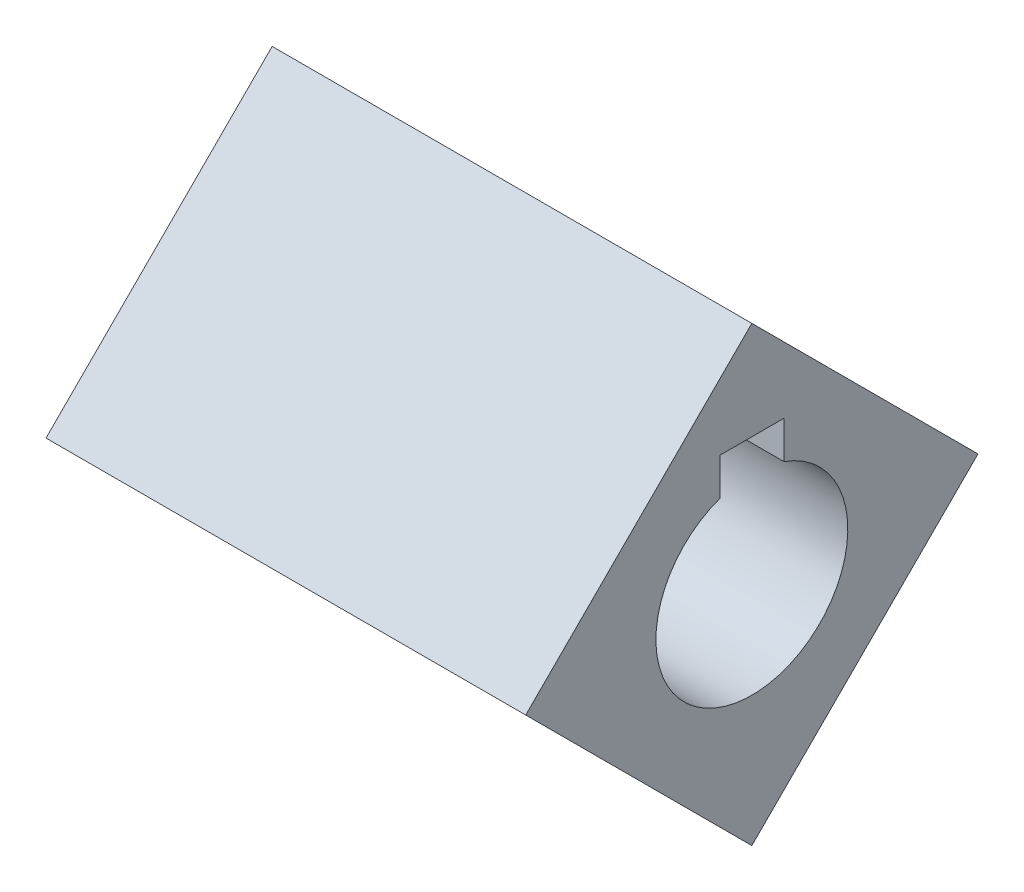
ISO-10303-21;
HEADER;
FILE_DESCRIPTION(('STEP AP214'),'2;1');
FILE_NAME('part.step','',(''),(''),'','','');
FILE_SCHEMA(('AUTOMOTIVE_DESIGN { 1 0 10303 214 1 1 1 1 }'));
ENDSEC;
DATA;
#1=APPLICATION_CONTEXT('core data for automotive mechanical design processes');
#2=APPLICATION_PROTOCOL_DEFINITION('international standard','automotive_design',2000,#1);
#3=PRODUCT_CONTEXT('',#1,'mechanical');
#4=PRODUCT('Part','Part','',(#3));
#5=PRODUCT_RELATED_PRODUCT_CATEGORY('part','',(#4));
#6=PRODUCT_DEFINITION_FORMATION('','',#4);
#7=PRODUCT_DEFINITION_CONTEXT('part definition',#1,'design');
#8=PRODUCT_DEFINITION('design','',#6,#7);
#9=PRODUCT_DEFINITION_SHAPE('','',#8);
#10=(LENGTH_UNIT() NAMED_UNIT(*) SI_UNIT(.MILLI.,.METRE.));
#11=(NAMED_UNIT(*) PLANE_ANGLE_UNIT() SI_UNIT($,.RADIAN.));
#12=(NAMED_UNIT(*) SI_UNIT($,.STERADIAN.) SOLID_ANGLE_UNIT());
#13=UNCERTAINTY_MEASURE_WITH_UNIT(LENGTH_MEASURE(1.E-05),#10,'distance_accuracy_value','');
#14=(GEOMETRIC_REPRESENTATION_CONTEXT(3) GLOBAL_UNCERTAINTY_ASSIGNED_CONTEXT((#13)) GLOBAL_UNIT_ASSIGNED_CONTEXT((#10,
#11,#12)) REPRESENTATION_CONTEXT('',''));
#15=CARTESIAN_POINT('',(0.,0.,0.));
#16=DIRECTION('',(0.,0.,1.));
#17=DIRECTION('',(1.,0.,0.));
#18=AXIS2_PLACEMENT_3D('',#15,#16,#17);
#19=CARTESIAN_POINT('',(0.,0.,0.));
#20=DIRECTION('',(-1.,0.,0.));
#21=DIRECTION('',(0.,0.,1.));
#22=AXIS2_PLACEMENT_3D('',#19,#20,#21);
#23=PLANE('',#22);
#24=DIRECTION('',(0.,1.,0.));
#25=VECTOR('',#24,1.);
#26=CARTESIAN_POINT('',(0.,8.,2.));
#27=LINE('',#26,#25);
#28=CARTESIAN_POINT('',(0.,5.65685424949238,2.));
#29=VERTEX_POINT('',#28);
#30=CARTESIAN_POINT('',(0.,8.,2.));
#31=VERTEX_POINT('',#30);
#32=EDGE_CURVE('E136',#29,#31,#27,.T.);
#33=ORIENTED_EDGE('',*,*,#32,.F.);
#34=CARTESIAN_POINT('',(0.,0.,0.));
#35=DIRECTION('',(-1.,0.,0.));
#36=DIRECTION('',(0.,0.,1.));
#37=AXIS2_PLACEMENT_3D('',#34,#35,#36);
#38=CIRCLE('',#37,6.);
#39=CARTESIAN_POINT('',(0.,5.65685424949238,-2.));
#40=VERTEX_POINT('',#39);
#41=EDGE_CURVE('E151',#40,#29,#38,.T.);
#42=ORIENTED_EDGE('',*,*,#41,.F.);
#43=DIRECTION('',(0.,-1.,0.));
#44=VECTOR('',#43,1.);
#45=CARTESIAN_POINT('',(0.,8.,-2.));
#46=LINE('',#45,#44);
#47=CARTESIAN_POINT('',(0.,8.,-2.));
#48=VERTEX_POINT('',#47);
#49=EDGE_CURVE('E145',#48,#40,#46,.T.);
#50=ORIENTED_EDGE('',*,*,#49,.F.);
#51=DIRECTION('',(0.,0.,-1.));
#52=VECTOR('',#51,1.);
#53=CARTESIAN_POINT('',(0.,8.,-2.));
#54=LINE('',#53,#52);
#55=EDGE_CURVE('E129',#31,#48,#54,.T.);
#56=ORIENTED_EDGE('',*,*,#55,.F.);
#57=EDGE_LOOP('',(#33,#42,#50,#56));
#58=FACE_BOUND('',#57,.T.);
#59=DIRECTION('',(0.,-0.707106781186548,-0.707106781186547));
#60=VECTOR('',#59,1.);
#61=CARTESIAN_POINT('',(0.,0.,14.142135623731));
#62=LINE('',#61,#60);
#63=CARTESIAN_POINT('',(0.,0.,14.1421356237309));
#64=VERTEX_POINT('',#63);
#65=CARTESIAN_POINT('',(0.,-14.142135623731,0.));
#66=VERTEX_POINT('',#65);
#67=EDGE_CURVE('E114',#64,#66,#62,.T.);
#68=ORIENTED_EDGE('',*,*,#67,.F.);
#69=DIRECTION('',(0.,-0.707106781186548,0.707106781186548));
#70=VECTOR('',#69,1.);
#71=CARTESIAN_POINT('',(0.,0.,14.142135623731));
#72=LINE('',#71,#70);
#73=CARTESIAN_POINT('',(0.,14.142135623731,0.));
#74=VERTEX_POINT('',#73);
#75=EDGE_CURVE('E48',#74,#64,#72,.T.);
#76=ORIENTED_EDGE('',*,*,#75,.F.);
#77=DIRECTION('',(0.,0.707106781186548,0.707106781186547));
#78=VECTOR('',#77,1.);
#79=CARTESIAN_POINT('',(0.,14.142135623731,0.));
#80=LINE('',#79,#78);
#81=CARTESIAN_POINT('',(0.,0.,-14.142135623731));
#82=VERTEX_POINT('',#81);
#83=EDGE_CURVE('E102',#82,#74,#80,.T.);
#84=ORIENTED_EDGE('',*,*,#83,.F.);
#85=DIRECTION('',(0.,0.707106781186547,-0.707106781186548));
#86=VECTOR('',#85,1.);
#87=CARTESIAN_POINT('',(0.,-14.142135623731,0.));
#88=LINE('',#87,#86);
#89=EDGE_CURVE('E109',#66,#82,#88,.T.);
#90=ORIENTED_EDGE('',*,*,#89,.F.);
#91=EDGE_LOOP('',(#68,#76,#84,#90));
#92=FACE_BOUND('',#91,.T.);
#93=ADVANCED_FACE('F34',(#58,#92),#23,.T.);
#94=CARTESIAN_POINT('',(30.,17.5,0.));
#95=DIRECTION('',(1.,0.,0.));
#96=DIRECTION('',(0.,0.,-1.));
#97=AXIS2_PLACEMENT_3D('',#94,#95,#96);
#98=PLANE('',#97);
#99=DIRECTION('',(0.,1.,0.));
#100=VECTOR('',#99,1.);
#101=CARTESIAN_POINT('',(30.,8.,2.));
#102=LINE('',#101,#100);
#103=CARTESIAN_POINT('',(30.,5.65685424949238,2.));
#104=VERTEX_POINT('',#103);
#105=CARTESIAN_POINT('',(30.,8.,2.));
#106=VERTEX_POINT('',#105);
#107=EDGE_CURVE('E139',#104,#106,#102,.T.);
#108=ORIENTED_EDGE('',*,*,#107,.T.);
#109=DIRECTION('',(0.,0.,-1.));
#110=VECTOR('',#109,1.);
#111=CARTESIAN_POINT('',(30.,8.,-2.));
#112=LINE('',#111,#110);
#113=CARTESIAN_POINT('',(30.,8.,-2.));
#114=VERTEX_POINT('',#113);
#115=EDGE_CURVE('E132',#106,#114,#112,.T.);
#116=ORIENTED_EDGE('',*,*,#115,.T.);
#117=DIRECTION('',(0.,-1.,0.));
#118=VECTOR('',#117,1.);
#119=CARTESIAN_POINT('',(30.,8.,-2.));
#120=LINE('',#119,#118);
#121=CARTESIAN_POINT('',(30.,5.65685424949238,-2.));
#122=VERTEX_POINT('',#121);
#123=EDGE_CURVE('E135',#114,#122,#120,.T.);
#124=ORIENTED_EDGE('',*,*,#123,.T.);
#125=CARTESIAN_POINT('',(30.,0.,0.));
#126=DIRECTION('',(-1.,0.,0.));
#127=DIRECTION('',(0.,0.,1.));
#128=AXIS2_PLACEMENT_3D('',#125,#126,#127);
#129=CIRCLE('',#128,6.);
#130=EDGE_CURVE('E153',#122,#104,#129,.T.);
#131=ORIENTED_EDGE('',*,*,#130,.T.);
#132=EDGE_LOOP('',(#108,#116,#124,#131));
#133=FACE_BOUND('',#132,.T.);
#134=DIRECTION('',(0.,0.707106781186548,0.707106781186547));
#135=VECTOR('',#134,1.);
#136=CARTESIAN_POINT('',(30.,14.142135623731,0.));
#137=LINE('',#136,#135);
#138=CARTESIAN_POINT('',(30.,0.,-14.142135623731));
#139=VERTEX_POINT('',#138);
#140=CARTESIAN_POINT('',(30.,14.142135623731,0.));
#141=VERTEX_POINT('',#140);
#142=EDGE_CURVE('E104',#139,#141,#137,.T.);
#143=ORIENTED_EDGE('',*,*,#142,.T.);
#144=DIRECTION('',(0.,-0.707106781186548,0.707106781186548));
#145=VECTOR('',#144,1.);
#146=CARTESIAN_POINT('',(30.,0.,14.142135623731));
#147=LINE('',#146,#145);
#148=CARTESIAN_POINT('',(30.,0.,14.1421356237309));
#149=VERTEX_POINT('',#148);
#150=EDGE_CURVE('E121',#141,#149,#147,.T.);
#151=ORIENTED_EDGE('',*,*,#150,.T.);
#152=DIRECTION('',(0.,-0.707106781186548,-0.707106781186547));
#153=VECTOR('',#152,1.);
#154=CARTESIAN_POINT('',(30.,0.,14.142135623731));
#155=LINE('',#154,#153);
#156=CARTESIAN_POINT('',(30.,-14.142135623731,0.));
#157=VERTEX_POINT('',#156);
#158=EDGE_CURVE('E124',#149,#157,#155,.T.);
#159=ORIENTED_EDGE('',*,*,#158,.T.);
#160=DIRECTION('',(0.,0.707106781186547,-0.707106781186548));
#161=VECTOR('',#160,1.);
#162=CARTESIAN_POINT('',(30.,-14.142135623731,0.));
#163=LINE('',#162,#161);
#164=EDGE_CURVE('E56',#157,#139,#163,.T.);
#165=ORIENTED_EDGE('',*,*,#164,.T.);
#166=EDGE_LOOP('',(#143,#151,#159,#165));
#167=FACE_BOUND('',#166,.T.);
#168=ADVANCED_FACE('F174',(#133,#167),#98,.T.);
#169=CARTESIAN_POINT('',(30.,0.,0.));
#170=DIRECTION('',(-1.,0.,0.));
#171=DIRECTION('',(0.,0.,1.));
#172=AXIS2_PLACEMENT_3D('',#169,#170,#171);
#173=CYLINDRICAL_SURFACE('',#172,6.);
#174=ORIENTED_EDGE('',*,*,#41,.T.);
#175=DIRECTION('',(-1.,0.,0.));
#176=VECTOR('',#175,1.);
#177=CARTESIAN_POINT('',(30.,5.65685424949238,2.));
#178=LINE('',#177,#176);
#179=EDGE_CURVE('E12',#29,#104,#178,.F.);
#180=ORIENTED_EDGE('',*,*,#179,.T.);
#181=ORIENTED_EDGE('',*,*,#130,.F.);
#182=DIRECTION('',(-1.,0.,0.));
#183=VECTOR('',#182,1.);
#184=CARTESIAN_POINT('',(30.,5.65685424949238,-2.));
#185=LINE('',#184,#183);
#186=EDGE_CURVE('E41',#122,#40,#185,.T.);
#187=ORIENTED_EDGE('',*,*,#186,.T.);
#188=EDGE_LOOP('',(#174,#180,#181,#187));
#189=FACE_BOUND('',#188,.T.);
#190=ADVANCED_FACE('F161',(#189),#173,.F.);
#191=CARTESIAN_POINT('',(30.,8.,2.));
#192=DIRECTION('',(0.,0.,1.));
#193=DIRECTION('',(1.,0.,0.));
#194=AXIS2_PLACEMENT_3D('',#191,#192,#193);
#195=PLANE('',#194);
#196=ORIENTED_EDGE('',*,*,#32,.T.);
#197=DIRECTION('',(-1.,0.,0.));
#198=VECTOR('',#197,1.);
#199=CARTESIAN_POINT('',(30.,8.,2.));
#200=LINE('',#199,#198);
#201=EDGE_CURVE('E148',#106,#31,#200,.T.);
#202=ORIENTED_EDGE('',*,*,#201,.F.);
#203=ORIENTED_EDGE('',*,*,#107,.F.);
#204=ORIENTED_EDGE('',*,*,#179,.F.);
#205=EDGE_LOOP('',(#196,#202,#203,#204));
#206=FACE_BOUND('',#205,.T.);
#207=ADVANCED_FACE('F169',(#206),#195,.F.);
#208=CARTESIAN_POINT('',(30.,8.,-2.));
#209=DIRECTION('',(0.,0.,-1.));
#210=DIRECTION('',(-1.,0.,0.));
#211=AXIS2_PLACEMENT_3D('',#208,#209,#210);
#212=PLANE('',#211);
#213=ORIENTED_EDGE('',*,*,#123,.F.);
#214=DIRECTION('',(-1.,0.,0.));
#215=VECTOR('',#214,1.);
#216=CARTESIAN_POINT('',(30.,8.,-2.));
#217=LINE('',#216,#215);
#218=EDGE_CURVE('E142',#114,#48,#217,.T.);
#219=ORIENTED_EDGE('',*,*,#218,.T.);
#220=ORIENTED_EDGE('',*,*,#49,.T.);
#221=ORIENTED_EDGE('',*,*,#186,.F.);
#222=EDGE_LOOP('',(#213,#219,#220,#221));
#223=FACE_BOUND('',#222,.T.);
#224=ADVANCED_FACE('F176',(#223),#212,.F.);
#225=CARTESIAN_POINT('',(30.,8.,-2.));
#226=DIRECTION('',(0.,1.,0.));
#227=DIRECTION('',(0.,0.,1.));
#228=AXIS2_PLACEMENT_3D('',#225,#226,#227);
#229=PLANE('',#228);
#230=ORIENTED_EDGE('',*,*,#55,.T.);
#231=ORIENTED_EDGE('',*,*,#218,.F.);
#232=ORIENTED_EDGE('',*,*,#115,.F.);
#233=ORIENTED_EDGE('',*,*,#201,.T.);
#234=EDGE_LOOP('',(#230,#231,#232,#233));
#235=FACE_BOUND('',#234,.T.);
#236=ADVANCED_FACE('F172',(#235),#229,.F.);
#237=CARTESIAN_POINT('',(0.,0.,14.142135623731));
#238=DIRECTION('',(0.,0.707106781186548,0.707106781186547));
#239=DIRECTION('',(0.,-0.707106781186547,0.707106781186548));
#240=AXIS2_PLACEMENT_3D('',#237,#238,#239);
#241=PLANE('',#240);
#242=ORIENTED_EDGE('',*,*,#150,.F.);
#243=DIRECTION('',(1.,0.,0.));
#244=VECTOR('',#243,1.);
#245=CARTESIAN_POINT('',(0.,14.142135623731,0.));
#246=LINE('',#245,#244);
#247=EDGE_CURVE('E105',#74,#141,#246,.T.);
#248=ORIENTED_EDGE('',*,*,#247,.F.);
#249=ORIENTED_EDGE('',*,*,#75,.T.);
#250=DIRECTION('',(1.,0.,0.));
#251=VECTOR('',#250,1.);
#252=CARTESIAN_POINT('',(0.,0.,14.142135623731));
#253=LINE('',#252,#251);
#254=EDGE_CURVE('E116',#64,#149,#253,.T.);
#255=ORIENTED_EDGE('',*,*,#254,.T.);
#256=EDGE_LOOP('',(#242,#248,#249,#255));
#257=FACE_BOUND('',#256,.T.);
#258=ADVANCED_FACE('F183',(#257),#241,.T.);
#259=CARTESIAN_POINT('',(0.,14.142135623731,0.));
#260=DIRECTION('',(0.,0.707106781186547,-0.707106781186548));
#261=DIRECTION('',(0.,0.707106781186548,0.707106781186547));
#262=AXIS2_PLACEMENT_3D('',#259,#260,#261);
#263=PLANE('',#262);
#264=ORIENTED_EDGE('',*,*,#142,.F.);
#265=DIRECTION('',(1.,0.,0.));
#266=VECTOR('',#265,1.);
#267=CARTESIAN_POINT('',(0.,0.,-14.142135623731));
#268=LINE('',#267,#266);
#269=EDGE_CURVE('E98',#82,#139,#268,.T.);
#270=ORIENTED_EDGE('',*,*,#269,.F.);
#271=ORIENTED_EDGE('',*,*,#83,.T.);
#272=ORIENTED_EDGE('',*,*,#247,.T.);
#273=EDGE_LOOP('',(#264,#270,#271,#272));
#274=FACE_BOUND('',#273,.T.);
#275=ADVANCED_FACE('F100',(#274),#263,.T.);
#276=CARTESIAN_POINT('',(0.,-14.142135623731,0.));
#277=DIRECTION('',(0.,-0.707106781186548,-0.707106781186547));
#278=DIRECTION('',(0.,0.707106781186547,-0.707106781186548));
#279=AXIS2_PLACEMENT_3D('',#276,#277,#278);
#280=PLANE('',#279);
#281=ORIENTED_EDGE('',*,*,#164,.F.);
#282=DIRECTION('',(1.,0.,0.));
#283=VECTOR('',#282,1.);
#284=CARTESIAN_POINT('',(0.,-14.142135623731,0.));
#285=LINE('',#284,#283);
#286=EDGE_CURVE('E106',#66,#157,#285,.T.);
#287=ORIENTED_EDGE('',*,*,#286,.F.);
#288=ORIENTED_EDGE('',*,*,#89,.T.);
#289=ORIENTED_EDGE('',*,*,#269,.T.);
#290=EDGE_LOOP('',(#281,#287,#288,#289));
#291=FACE_BOUND('',#290,.T.);
#292=ADVANCED_FACE('F110',(#291),#280,.T.);
#293=CARTESIAN_POINT('',(0.,0.,14.142135623731));
#294=DIRECTION('',(0.,-0.707106781186547,0.707106781186548));
#295=DIRECTION('',(0.,-0.707106781186548,-0.707106781186547));
#296=AXIS2_PLACEMENT_3D('',#293,#294,#295);
#297=PLANE('',#296);
#298=ORIENTED_EDGE('',*,*,#158,.F.);
#299=ORIENTED_EDGE('',*,*,#254,.F.);
#300=ORIENTED_EDGE('',*,*,#67,.T.);
#301=ORIENTED_EDGE('',*,*,#286,.T.);
#302=EDGE_LOOP('',(#298,#299,#300,#301));
#303=FACE_BOUND('',#302,.T.);
#304=ADVANCED_FACE('F243',(#303),#297,.T.);
#305=CLOSED_SHELL('',(#93,#168,#190,#207,#224,#236,#258,#275,#292,#304));
#306=MANIFOLD_SOLID_BREP('B2',#305);
#307=ADVANCED_BREP_SHAPE_REPRESENTATION('',(#18,#306),#14);
#308=SHAPE_DEFINITION_REPRESENTATION(#9,#307);
ENDSEC;
END-ISO-10303-21;
